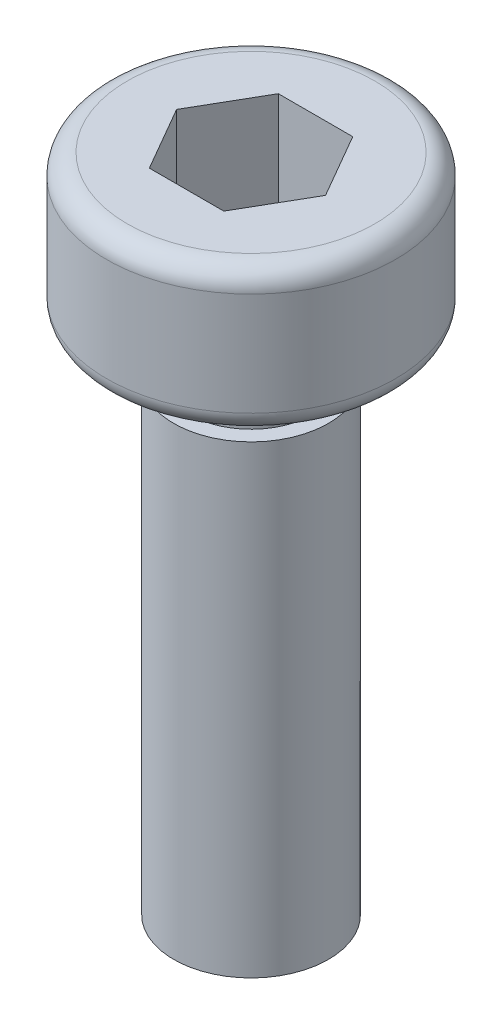
ISO-10303-21;
HEADER;
FILE_DESCRIPTION(('STEP AP214'),'2;1');
FILE_NAME('part.step','',(''),(''),'','','');
FILE_SCHEMA(('AUTOMOTIVE_DESIGN { 1 0 10303 214 1 1 1 1 }'));
ENDSEC;
DATA;
#1=APPLICATION_CONTEXT('core data for automotive mechanical design processes');
#2=APPLICATION_PROTOCOL_DEFINITION('international standard','automotive_design',2000,#1);
#3=PRODUCT_CONTEXT('',#1,'mechanical');
#4=PRODUCT('Part','Part','',(#3));
#5=PRODUCT_RELATED_PRODUCT_CATEGORY('part','',(#4));
#6=PRODUCT_DEFINITION_FORMATION('','',#4);
#7=PRODUCT_DEFINITION_CONTEXT('part definition',#1,'design');
#8=PRODUCT_DEFINITION('design','',#6,#7);
#9=PRODUCT_DEFINITION_SHAPE('','',#8);
#10=(LENGTH_UNIT() NAMED_UNIT(*) SI_UNIT(.MILLI.,.METRE.));
#11=(NAMED_UNIT(*) PLANE_ANGLE_UNIT() SI_UNIT($,.RADIAN.));
#12=(NAMED_UNIT(*) SI_UNIT($,.STERADIAN.) SOLID_ANGLE_UNIT());
#13=UNCERTAINTY_MEASURE_WITH_UNIT(LENGTH_MEASURE(1.E-05),#10,'distance_accuracy_value','');
#14=(GEOMETRIC_REPRESENTATION_CONTEXT(3) GLOBAL_UNCERTAINTY_ASSIGNED_CONTEXT((#13)) GLOBAL_UNIT_ASSIGNED_CONTEXT((#10,
#11,#12)) REPRESENTATION_CONTEXT('',''));
#15=CARTESIAN_POINT('',(0.,0.,0.));
#16=DIRECTION('',(0.,0.,1.));
#17=DIRECTION('',(1.,0.,0.));
#18=AXIS2_PLACEMENT_3D('',#15,#16,#17);
#19=CARTESIAN_POINT('',(0.,12.8,0.));
#20=DIRECTION('',(0.,-1.,0.));
#21=DIRECTION('',(0.,0.,-1.));
#22=AXIS2_PLACEMENT_3D('',#19,#20,#21);
#23=PLANE('',#22);
#24=DIRECTION('',(-0.5,0.,0.866025403784439));
#25=VECTOR('',#24,1.);
#26=CARTESIAN_POINT('',(-0.721687836487032,12.8,-1.25));
#27=LINE('',#26,#25);
#28=CARTESIAN_POINT('',(-0.721687836487032,12.8,-1.25));
#29=VERTEX_POINT('',#28);
#30=CARTESIAN_POINT('',(-1.44337567297406,12.8,0.));
#31=VERTEX_POINT('',#30);
#32=EDGE_CURVE('E126',#29,#31,#27,.T.);
#33=ORIENTED_EDGE('',*,*,#32,.F.);
#34=DIRECTION('',(-1.,0.,0.));
#35=VECTOR('',#34,1.);
#36=CARTESIAN_POINT('',(0.721687836487033,12.8,-1.25));
#37=LINE('',#36,#35);
#38=CARTESIAN_POINT('',(0.721687836487033,12.8,-1.25));
#39=VERTEX_POINT('',#38);
#40=EDGE_CURVE('E52',#39,#29,#37,.T.);
#41=ORIENTED_EDGE('',*,*,#40,.F.);
#42=DIRECTION('',(-0.5,0.,-0.866025403784439));
#43=VECTOR('',#42,1.);
#44=CARTESIAN_POINT('',(1.44337567297406,12.8,0.));
#45=LINE('',#44,#43);
#46=CARTESIAN_POINT('',(1.44337567297406,12.8,0.));
#47=VERTEX_POINT('',#46);
#48=EDGE_CURVE('E135',#47,#39,#45,.T.);
#49=ORIENTED_EDGE('',*,*,#48,.F.);
#50=DIRECTION('',(0.5,0.,-0.866025403784439));
#51=VECTOR('',#50,1.);
#52=CARTESIAN_POINT('',(0.721687836487032,12.8,1.25));
#53=LINE('',#52,#51);
#54=CARTESIAN_POINT('',(0.721687836487032,12.8,1.25));
#55=VERTEX_POINT('',#54);
#56=EDGE_CURVE('E133',#55,#47,#53,.T.);
#57=ORIENTED_EDGE('',*,*,#56,.F.);
#58=DIRECTION('',(1.,0.,0.));
#59=VECTOR('',#58,1.);
#60=CARTESIAN_POINT('',(-0.721687836487033,12.8,1.25));
#61=LINE('',#60,#59);
#62=CARTESIAN_POINT('',(-0.721687836487033,12.8,1.25));
#63=VERTEX_POINT('',#62);
#64=EDGE_CURVE('E100',#63,#55,#61,.T.);
#65=ORIENTED_EDGE('',*,*,#64,.F.);
#66=DIRECTION('',(0.5,0.,0.866025403784439));
#67=VECTOR('',#66,1.);
#68=CARTESIAN_POINT('',(-1.44337567297406,12.8,0.));
#69=LINE('',#68,#67);
#70=EDGE_CURVE('E129',#31,#63,#69,.T.);
#71=ORIENTED_EDGE('',*,*,#70,.F.);
#72=EDGE_LOOP('',(#33,#41,#49,#57,#65,#71));
#73=FACE_BOUND('',#72,.T.);
#74=CARTESIAN_POINT('',(0.,12.8,0.));
#75=DIRECTION('',(0.,-1.,0.));
#76=DIRECTION('',(0.,0.,-1.));
#77=AXIS2_PLACEMENT_3D('',#74,#75,#76);
#78=CIRCLE('',#77,2.4);
#79=CARTESIAN_POINT('',(0.,12.8,-2.4));
#80=VERTEX_POINT('',#79);
#81=EDGE_CURVE('E11',#80,#80,#78,.T.);
#82=ORIENTED_EDGE('',*,*,#81,.F.);
#83=EDGE_LOOP('',(#82));
#84=FACE_BOUND('',#83,.T.);
#85=ADVANCED_FACE('F38',(#73,#84),#23,.F.);
#86=CARTESIAN_POINT('',(0.,12.4,0.));
#87=DIRECTION('',(0.,-1.,0.));
#88=DIRECTION('',(0.,0.,-1.));
#89=AXIS2_PLACEMENT_3D('',#86,#87,#88);
#90=TOROIDAL_SURFACE('',#89,2.4,0.400000000000001);
#91=CARTESIAN_POINT('',(0.,12.4,0.));
#92=DIRECTION('',(0.,-1.,0.));
#93=DIRECTION('',(0.,0.,-1.));
#94=AXIS2_PLACEMENT_3D('',#91,#92,#93);
#95=CIRCLE('',#94,2.8);
#96=CARTESIAN_POINT('',(0.,12.4,-2.8));
#97=VERTEX_POINT('',#96);
#98=EDGE_CURVE('E45',#97,#97,#95,.T.);
#99=ORIENTED_EDGE('',*,*,#98,.F.);
#100=EDGE_LOOP('',(#99));
#101=FACE_BOUND('',#100,.T.);
#102=ORIENTED_EDGE('',*,*,#81,.T.);
#103=EDGE_LOOP('',(#102));
#104=FACE_BOUND('',#103,.T.);
#105=ADVANCED_FACE('F166',(#101,#104),#90,.T.);
#106=CARTESIAN_POINT('',(0.,0.,0.));
#107=DIRECTION('',(0.,-1.,0.));
#108=DIRECTION('',(0.,0.,-1.));
#109=AXIS2_PLACEMENT_3D('',#106,#107,#108);
#110=CYLINDRICAL_SURFACE('',#109,2.8);
#111=CARTESIAN_POINT('',(0.,10.4,0.));
#112=DIRECTION('',(0.,-1.,0.));
#113=DIRECTION('',(0.,0.,-1.));
#114=AXIS2_PLACEMENT_3D('',#111,#112,#113);
#115=CIRCLE('',#114,2.8);
#116=CARTESIAN_POINT('',(0.,10.4,-2.8));
#117=VERTEX_POINT('',#116);
#118=EDGE_CURVE('E159',#117,#117,#115,.T.);
#119=ORIENTED_EDGE('',*,*,#118,.F.);
#120=EDGE_LOOP('',(#119));
#121=FACE_BOUND('',#120,.T.);
#122=ORIENTED_EDGE('',*,*,#98,.T.);
#123=EDGE_LOOP('',(#122));
#124=FACE_BOUND('',#123,.T.);
#125=ADVANCED_FACE('F164',(#121,#124),#110,.T.);
#126=CARTESIAN_POINT('',(0.,10.4,0.));
#127=DIRECTION('',(0.,-1.,0.));
#128=DIRECTION('',(0.,0.,-1.));
#129=AXIS2_PLACEMENT_3D('',#126,#127,#128);
#130=TOROIDAL_SURFACE('',#129,2.4,0.4);
#131=CARTESIAN_POINT('',(0.,10.,0.));
#132=DIRECTION('',(0.,-1.,0.));
#133=DIRECTION('',(0.,0.,-1.));
#134=AXIS2_PLACEMENT_3D('',#131,#132,#133);
#135=CIRCLE('',#134,2.4);
#136=CARTESIAN_POINT('',(0.,10.,-2.4));
#137=VERTEX_POINT('',#136);
#138=EDGE_CURVE('E156',#137,#137,#135,.T.);
#139=ORIENTED_EDGE('',*,*,#138,.F.);
#140=EDGE_LOOP('',(#139));
#141=FACE_BOUND('',#140,.T.);
#142=ORIENTED_EDGE('',*,*,#118,.T.);
#143=EDGE_LOOP('',(#142));
#144=FACE_BOUND('',#143,.T.);
#145=ADVANCED_FACE('F211',(#141,#144),#130,.T.);
#146=CARTESIAN_POINT('',(-2.4,10.,0.));
#147=DIRECTION('',(0.,1.,0.));
#148=DIRECTION('',(0.,0.,1.));
#149=AXIS2_PLACEMENT_3D('',#146,#147,#148);
#150=PLANE('',#149);
#151=CARTESIAN_POINT('',(0.,10.,0.));
#152=DIRECTION('',(0.,-1.,0.));
#153=DIRECTION('',(0.,0.,-1.));
#154=AXIS2_PLACEMENT_3D('',#151,#152,#153);
#155=CIRCLE('',#154,1.2);
#156=CARTESIAN_POINT('',(0.,10.,-1.2));
#157=VERTEX_POINT('',#156);
#158=EDGE_CURVE('E153',#157,#157,#155,.T.);
#159=ORIENTED_EDGE('',*,*,#158,.F.);
#160=EDGE_LOOP('',(#159));
#161=FACE_BOUND('',#160,.T.);
#162=ORIENTED_EDGE('',*,*,#138,.T.);
#163=EDGE_LOOP('',(#162));
#164=FACE_BOUND('',#163,.T.);
#165=ADVANCED_FACE('F207',(#161,#164),#150,.F.);
#166=CARTESIAN_POINT('',(0.,0.,0.));
#167=DIRECTION('',(0.,-1.,0.));
#168=DIRECTION('',(0.,0.,-1.));
#169=AXIS2_PLACEMENT_3D('',#166,#167,#168);
#170=CYLINDRICAL_SURFACE('',#169,1.2);
#171=CARTESIAN_POINT('',(0.,9.,0.));
#172=DIRECTION('',(0.,-1.,0.));
#173=DIRECTION('',(0.,0.,-1.));
#174=AXIS2_PLACEMENT_3D('',#171,#172,#173);
#175=CIRCLE('',#174,1.2);
#176=CARTESIAN_POINT('',(0.,9.,-1.2));
#177=VERTEX_POINT('',#176);
#178=EDGE_CURVE('E150',#177,#177,#175,.T.);
#179=ORIENTED_EDGE('',*,*,#178,.F.);
#180=EDGE_LOOP('',(#179));
#181=FACE_BOUND('',#180,.T.);
#182=ORIENTED_EDGE('',*,*,#158,.T.);
#183=EDGE_LOOP('',(#182));
#184=FACE_BOUND('',#183,.T.);
#185=ADVANCED_FACE('F203',(#181,#184),#170,.T.);
#186=CARTESIAN_POINT('',(-1.2,9.,0.));
#187=DIRECTION('',(0.,-1.,0.));
#188=DIRECTION('',(0.,0.,-1.));
#189=AXIS2_PLACEMENT_3D('',#186,#187,#188);
#190=PLANE('',#189);
#191=CARTESIAN_POINT('',(0.,9.,0.));
#192=DIRECTION('',(0.,-1.,0.));
#193=DIRECTION('',(0.,0.,-1.));
#194=AXIS2_PLACEMENT_3D('',#191,#192,#193);
#195=CIRCLE('',#194,1.5);
#196=CARTESIAN_POINT('',(0.,9.,-1.5));
#197=VERTEX_POINT('',#196);
#198=EDGE_CURVE('E147',#197,#197,#195,.T.);
#199=ORIENTED_EDGE('',*,*,#198,.F.);
#200=EDGE_LOOP('',(#199));
#201=FACE_BOUND('',#200,.T.);
#202=ORIENTED_EDGE('',*,*,#178,.T.);
#203=EDGE_LOOP('',(#202));
#204=FACE_BOUND('',#203,.T.);
#205=ADVANCED_FACE('F199',(#201,#204),#190,.F.);
#206=CARTESIAN_POINT('',(0.,0.,0.));
#207=DIRECTION('',(0.,-1.,0.));
#208=DIRECTION('',(0.,0.,-1.));
#209=AXIS2_PLACEMENT_3D('',#206,#207,#208);
#210=CYLINDRICAL_SURFACE('',#209,1.5);
#211=CARTESIAN_POINT('',(0.,0.,0.));
#212=DIRECTION('',(0.,-1.,0.));
#213=DIRECTION('',(0.,0.,-1.));
#214=AXIS2_PLACEMENT_3D('',#211,#212,#213);
#215=CIRCLE('',#214,1.5);
#216=CARTESIAN_POINT('',(0.,0.,-1.5));
#217=VERTEX_POINT('',#216);
#218=EDGE_CURVE('E139',#217,#217,#215,.T.);
#219=ORIENTED_EDGE('',*,*,#218,.F.);
#220=EDGE_LOOP('',(#219));
#221=FACE_BOUND('',#220,.T.);
#222=ORIENTED_EDGE('',*,*,#198,.T.);
#223=EDGE_LOOP('',(#222));
#224=FACE_BOUND('',#223,.T.);
#225=ADVANCED_FACE('F191',(#221,#224),#210,.T.);
#226=CARTESIAN_POINT('',(-1.5,0.,0.));
#227=DIRECTION('',(0.,1.,0.));
#228=DIRECTION('',(0.,0.,1.));
#229=AXIS2_PLACEMENT_3D('',#226,#227,#228);
#230=PLANE('',#229);
#231=ORIENTED_EDGE('',*,*,#218,.T.);
#232=EDGE_LOOP('',(#231));
#233=FACE_BOUND('',#232,.T.);
#234=ADVANCED_FACE('F184',(#233),#230,.F.);
#235=CARTESIAN_POINT('',(0.721687836487033,10.8,-1.25));
#236=DIRECTION('',(0.,0.,-1.));
#237=DIRECTION('',(-1.,0.,0.));
#238=AXIS2_PLACEMENT_3D('',#235,#236,#237);
#239=PLANE('',#238);
#240=ORIENTED_EDGE('',*,*,#40,.T.);
#241=DIRECTION('',(0.,1.,0.));
#242=VECTOR('',#241,1.);
#243=CARTESIAN_POINT('',(-0.721687836487032,10.8,-1.25));
#244=LINE('',#243,#242);
#245=CARTESIAN_POINT('',(-0.721687836487032,10.8,-1.25));
#246=VERTEX_POINT('',#245);
#247=EDGE_CURVE('E82',#246,#29,#244,.T.);
#248=ORIENTED_EDGE('',*,*,#247,.F.);
#249=DIRECTION('',(-1.,0.,0.));
#250=VECTOR('',#249,1.);
#251=CARTESIAN_POINT('',(0.721687836487033,10.8,-1.25));
#252=LINE('',#251,#250);
#253=CARTESIAN_POINT('',(0.721687836487033,10.8,-1.25));
#254=VERTEX_POINT('',#253);
#255=EDGE_CURVE('E137',#254,#246,#252,.T.);
#256=ORIENTED_EDGE('',*,*,#255,.F.);
#257=DIRECTION('',(0.,1.,0.));
#258=VECTOR('',#257,1.);
#259=CARTESIAN_POINT('',(0.721687836487033,10.8,-1.25));
#260=LINE('',#259,#258);
#261=EDGE_CURVE('E60',#254,#39,#260,.T.);
#262=ORIENTED_EDGE('',*,*,#261,.T.);
#263=EDGE_LOOP('',(#240,#248,#256,#262));
#264=FACE_BOUND('',#263,.T.);
#265=ADVANCED_FACE('F181',(#264),#239,.F.);
#266=CARTESIAN_POINT('',(1.44337567297406,10.8,0.));
#267=DIRECTION('',(0.866025403784439,0.,-0.5));
#268=DIRECTION('',(-0.5,0.,-0.866025403784439));
#269=AXIS2_PLACEMENT_3D('',#266,#267,#268);
#270=PLANE('',#269);
#271=ORIENTED_EDGE('',*,*,#48,.T.);
#272=ORIENTED_EDGE('',*,*,#261,.F.);
#273=DIRECTION('',(-0.5,0.,-0.866025403784439));
#274=VECTOR('',#273,1.);
#275=CARTESIAN_POINT('',(1.44337567297406,10.8,0.));
#276=LINE('',#275,#274);
#277=CARTESIAN_POINT('',(1.44337567297406,10.8,0.));
#278=VERTEX_POINT('',#277);
#279=EDGE_CURVE('E112',#278,#254,#276,.T.);
#280=ORIENTED_EDGE('',*,*,#279,.F.);
#281=DIRECTION('',(0.,1.,0.));
#282=VECTOR('',#281,1.);
#283=CARTESIAN_POINT('',(1.44337567297406,10.8,0.));
#284=LINE('',#283,#282);
#285=EDGE_CURVE('E104',#278,#47,#284,.T.);
#286=ORIENTED_EDGE('',*,*,#285,.T.);
#287=EDGE_LOOP('',(#271,#272,#280,#286));
#288=FACE_BOUND('',#287,.T.);
#289=ADVANCED_FACE('F183',(#288),#270,.F.);
#290=CARTESIAN_POINT('',(0.721687836487032,10.8,1.25));
#291=DIRECTION('',(0.866025403784439,0.,0.5));
#292=DIRECTION('',(0.5,0.,-0.866025403784439));
#293=AXIS2_PLACEMENT_3D('',#290,#291,#292);
#294=PLANE('',#293);
#295=ORIENTED_EDGE('',*,*,#56,.T.);
#296=ORIENTED_EDGE('',*,*,#285,.F.);
#297=DIRECTION('',(0.5,0.,-0.866025403784439));
#298=VECTOR('',#297,1.);
#299=CARTESIAN_POINT('',(0.721687836487032,10.8,1.25));
#300=LINE('',#299,#298);
#301=CARTESIAN_POINT('',(0.721687836487032,10.8,1.25));
#302=VERTEX_POINT('',#301);
#303=EDGE_CURVE('E108',#302,#278,#300,.T.);
#304=ORIENTED_EDGE('',*,*,#303,.F.);
#305=DIRECTION('',(0.,1.,0.));
#306=VECTOR('',#305,1.);
#307=CARTESIAN_POINT('',(0.721687836487032,10.8,1.25));
#308=LINE('',#307,#306);
#309=EDGE_CURVE('E93',#302,#55,#308,.T.);
#310=ORIENTED_EDGE('',*,*,#309,.T.);
#311=EDGE_LOOP('',(#295,#296,#304,#310));
#312=FACE_BOUND('',#311,.T.);
#313=ADVANCED_FACE('F109',(#312),#294,.F.);
#314=CARTESIAN_POINT('',(-0.721687836487033,10.8,1.25));
#315=DIRECTION('',(0.,0.,1.));
#316=DIRECTION('',(1.,0.,0.));
#317=AXIS2_PLACEMENT_3D('',#314,#315,#316);
#318=PLANE('',#317);
#319=ORIENTED_EDGE('',*,*,#64,.T.);
#320=ORIENTED_EDGE('',*,*,#309,.F.);
#321=DIRECTION('',(1.,0.,0.));
#322=VECTOR('',#321,1.);
#323=CARTESIAN_POINT('',(-0.721687836487033,10.8,1.25));
#324=LINE('',#323,#322);
#325=CARTESIAN_POINT('',(-0.721687836487033,10.8,1.25));
#326=VERTEX_POINT('',#325);
#327=EDGE_CURVE('E97',#326,#302,#324,.T.);
#328=ORIENTED_EDGE('',*,*,#327,.F.);
#329=DIRECTION('',(0.,1.,0.));
#330=VECTOR('',#329,1.);
#331=CARTESIAN_POINT('',(-0.721687836487033,10.8,1.25));
#332=LINE('',#331,#330);
#333=EDGE_CURVE('E105',#326,#63,#332,.T.);
#334=ORIENTED_EDGE('',*,*,#333,.T.);
#335=EDGE_LOOP('',(#319,#320,#328,#334));
#336=FACE_BOUND('',#335,.T.);
#337=ADVANCED_FACE('F95',(#336),#318,.F.);
#338=CARTESIAN_POINT('',(-1.44337567297406,10.8,0.));
#339=DIRECTION('',(-0.866025403784439,0.,0.5));
#340=DIRECTION('',(0.5,0.,0.866025403784439));
#341=AXIS2_PLACEMENT_3D('',#338,#339,#340);
#342=PLANE('',#341);
#343=ORIENTED_EDGE('',*,*,#70,.T.);
#344=ORIENTED_EDGE('',*,*,#333,.F.);
#345=DIRECTION('',(0.5,0.,0.866025403784439));
#346=VECTOR('',#345,1.);
#347=CARTESIAN_POINT('',(-1.44337567297406,10.8,0.));
#348=LINE('',#347,#346);
#349=CARTESIAN_POINT('',(-1.44337567297406,10.8,0.));
#350=VERTEX_POINT('',#349);
#351=EDGE_CURVE('E118',#350,#326,#348,.T.);
#352=ORIENTED_EDGE('',*,*,#351,.F.);
#353=DIRECTION('',(0.,1.,0.));
#354=VECTOR('',#353,1.);
#355=CARTESIAN_POINT('',(-1.44337567297406,10.8,0.));
#356=LINE('',#355,#354);
#357=EDGE_CURVE('E142',#350,#31,#356,.T.);
#358=ORIENTED_EDGE('',*,*,#357,.T.);
#359=EDGE_LOOP('',(#343,#344,#352,#358));
#360=FACE_BOUND('',#359,.T.);
#361=ADVANCED_FACE('F282',(#360),#342,.F.);
#362=CARTESIAN_POINT('',(-0.721687836487032,10.8,-1.25));
#363=DIRECTION('',(-0.866025403784439,0.,-0.5));
#364=DIRECTION('',(-0.5,0.,0.866025403784439));
#365=AXIS2_PLACEMENT_3D('',#362,#363,#364);
#366=PLANE('',#365);
#367=ORIENTED_EDGE('',*,*,#32,.T.);
#368=ORIENTED_EDGE('',*,*,#357,.F.);
#369=DIRECTION('',(-0.5,0.,0.866025403784439));
#370=VECTOR('',#369,1.);
#371=CARTESIAN_POINT('',(-0.721687836487032,10.8,-1.25));
#372=LINE('',#371,#370);
#373=EDGE_CURVE('E120',#246,#350,#372,.T.);
#374=ORIENTED_EDGE('',*,*,#373,.F.);
#375=ORIENTED_EDGE('',*,*,#247,.T.);
#376=EDGE_LOOP('',(#367,#368,#374,#375));
#377=FACE_BOUND('',#376,.T.);
#378=ADVANCED_FACE('F179',(#377),#366,.F.);
#379=CARTESIAN_POINT('',(0.,10.8,0.));
#380=DIRECTION('',(0.,1.,0.));
#381=DIRECTION('',(0.,0.,1.));
#382=AXIS2_PLACEMENT_3D('',#379,#380,#381);
#383=PLANE('',#382);
#384=ORIENTED_EDGE('',*,*,#255,.T.);
#385=ORIENTED_EDGE('',*,*,#373,.T.);
#386=ORIENTED_EDGE('',*,*,#351,.T.);
#387=ORIENTED_EDGE('',*,*,#327,.T.);
#388=ORIENTED_EDGE('',*,*,#303,.T.);
#389=ORIENTED_EDGE('',*,*,#279,.T.);
#390=EDGE_LOOP('',(#384,#385,#386,#387,#388,#389));
#391=FACE_BOUND('',#390,.T.);
#392=ADVANCED_FACE('F115',(#391),#383,.T.);
#393=CLOSED_SHELL('',(#85,#105,#125,#145,#165,#185,#205,#225,#234,#265,#289,#313,#337,#361,#378,#392));
#394=MANIFOLD_SOLID_BREP('B2',#393);
#395=ADVANCED_BREP_SHAPE_REPRESENTATION('',(#18,#394),#14);
#396=SHAPE_DEFINITION_REPRESENTATION(#9,#395);
ENDSEC;
END-ISO-10303-21;
